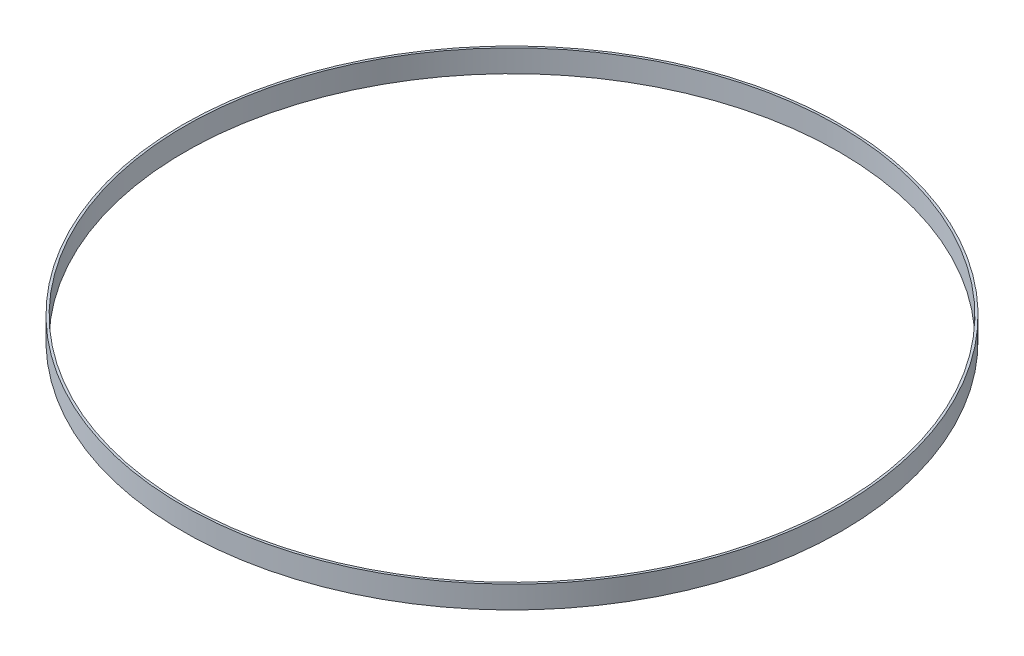
ISO-10303-21;
HEADER;
FILE_DESCRIPTION(('STEP AP214'),'2;1');
FILE_NAME('part.step','',(''),(''),'','','');
FILE_SCHEMA(('AUTOMOTIVE_DESIGN { 1 0 10303 214 1 1 1 1 }'));
ENDSEC;
DATA;
#1=APPLICATION_CONTEXT('core data for automotive mechanical design processes');
#2=APPLICATION_PROTOCOL_DEFINITION('international standard','automotive_design',2000,#1);
#3=PRODUCT_CONTEXT('',#1,'mechanical');
#4=PRODUCT('Part','Part','',(#3));
#5=PRODUCT_RELATED_PRODUCT_CATEGORY('part','',(#4));
#6=PRODUCT_DEFINITION_FORMATION('','',#4);
#7=PRODUCT_DEFINITION_CONTEXT('part definition',#1,'design');
#8=PRODUCT_DEFINITION('design','',#6,#7);
#9=PRODUCT_DEFINITION_SHAPE('','',#8);
#10=(LENGTH_UNIT() NAMED_UNIT(*) SI_UNIT(.MILLI.,.METRE.));
#11=(NAMED_UNIT(*) PLANE_ANGLE_UNIT() SI_UNIT($,.RADIAN.));
#12=(NAMED_UNIT(*) SI_UNIT($,.STERADIAN.) SOLID_ANGLE_UNIT());
#13=UNCERTAINTY_MEASURE_WITH_UNIT(LENGTH_MEASURE(1.E-05),#10,'distance_accuracy_value','');
#14=(GEOMETRIC_REPRESENTATION_CONTEXT(3) GLOBAL_UNCERTAINTY_ASSIGNED_CONTEXT((#13)) GLOBAL_UNIT_ASSIGNED_CONTEXT((#10,
#11,#12)) REPRESENTATION_CONTEXT('',''));
#15=CARTESIAN_POINT('',(0.,0.,0.));
#16=DIRECTION('',(0.,0.,1.));
#17=DIRECTION('',(1.,0.,0.));
#18=AXIS2_PLACEMENT_3D('',#15,#16,#17);
#19=CARTESIAN_POINT('',(0.,10.,0.));
#20=DIRECTION('',(0.,1.,0.));
#21=DIRECTION('',(0.,0.,1.));
#22=AXIS2_PLACEMENT_3D('',#19,#20,#21);
#23=PLANE('',#22);
#24=CARTESIAN_POINT('',(0.,10.,0.));
#25=DIRECTION('',(0.,1.,0.));
#26=DIRECTION('',(1.,0.,0.));
#27=AXIS2_PLACEMENT_3D('',#24,#25,#26);
#28=CIRCLE('',#27,147.05);
#29=CARTESIAN_POINT('',(147.05,10.,0.));
#30=VERTEX_POINT('',#29);
#31=EDGE_CURVE('E11',#30,#30,#28,.T.);
#32=ORIENTED_EDGE('',*,*,#31,.T.);
#33=EDGE_LOOP('',(#32));
#34=FACE_BOUND('',#33,.T.);
#35=CARTESIAN_POINT('',(0.,10.,0.));
#36=DIRECTION('',(0.,1.,0.));
#37=DIRECTION('',(0.,0.,1.));
#38=AXIS2_PLACEMENT_3D('',#35,#36,#37);
#39=CIRCLE('',#38,146.05);
#40=CARTESIAN_POINT('',(0.,10.,146.05));
#41=VERTEX_POINT('',#40);
#42=EDGE_CURVE('E56',#41,#41,#39,.T.);
#43=ORIENTED_EDGE('',*,*,#42,.F.);
#44=EDGE_LOOP('',(#43));
#45=FACE_BOUND('',#44,.T.);
#46=ADVANCED_FACE('F45',(#34,#45),#23,.T.);
#47=CARTESIAN_POINT('',(0.,0.,0.));
#48=DIRECTION('',(0.,1.,0.));
#49=DIRECTION('',(0.,0.,1.));
#50=AXIS2_PLACEMENT_3D('',#47,#48,#49);
#51=PLANE('',#50);
#52=CARTESIAN_POINT('',(0.,0.,0.));
#53=DIRECTION('',(0.,1.,0.));
#54=DIRECTION('',(1.,0.,0.));
#55=AXIS2_PLACEMENT_3D('',#52,#53,#54);
#56=CIRCLE('',#55,147.05);
#57=CARTESIAN_POINT('',(147.05,0.,0.));
#58=VERTEX_POINT('',#57);
#59=EDGE_CURVE('E49',#58,#58,#56,.T.);
#60=ORIENTED_EDGE('',*,*,#59,.F.);
#61=EDGE_LOOP('',(#60));
#62=FACE_BOUND('',#61,.T.);
#63=CARTESIAN_POINT('',(0.,0.,0.));
#64=DIRECTION('',(0.,1.,0.));
#65=DIRECTION('',(0.,0.,1.));
#66=AXIS2_PLACEMENT_3D('',#63,#64,#65);
#67=CIRCLE('',#66,146.05);
#68=CARTESIAN_POINT('',(0.,0.,146.05));
#69=VERTEX_POINT('',#68);
#70=EDGE_CURVE('E58',#69,#69,#67,.T.);
#71=ORIENTED_EDGE('',*,*,#70,.T.);
#72=EDGE_LOOP('',(#71));
#73=FACE_BOUND('',#72,.T.);
#74=ADVANCED_FACE('F68',(#62,#73),#51,.F.);
#75=CARTESIAN_POINT('',(0.,10.,0.));
#76=DIRECTION('',(0.,-1.,0.));
#77=DIRECTION('',(0.,0.,-1.));
#78=AXIS2_PLACEMENT_3D('',#75,#76,#77);
#79=CYLINDRICAL_SURFACE('',#78,147.05);
#80=ORIENTED_EDGE('',*,*,#31,.F.);
#81=EDGE_LOOP('',(#80));
#82=FACE_BOUND('',#81,.T.);
#83=ORIENTED_EDGE('',*,*,#59,.T.);
#84=EDGE_LOOP('',(#83));
#85=FACE_BOUND('',#84,.T.);
#86=ADVANCED_FACE('F47',(#82,#85),#79,.T.);
#87=CARTESIAN_POINT('',(0.,10.,0.));
#88=DIRECTION('',(0.,-1.,0.));
#89=DIRECTION('',(0.,0.,-1.));
#90=AXIS2_PLACEMENT_3D('',#87,#88,#89);
#91=CYLINDRICAL_SURFACE('',#90,146.05);
#92=ORIENTED_EDGE('',*,*,#42,.T.);
#93=EDGE_LOOP('',(#92));
#94=FACE_BOUND('',#93,.T.);
#95=ORIENTED_EDGE('',*,*,#70,.F.);
#96=EDGE_LOOP('',(#95));
#97=FACE_BOUND('',#96,.T.);
#98=ADVANCED_FACE('F64',(#94,#97),#91,.F.);
#99=CLOSED_SHELL('',(#46,#74,#86,#98));
#100=MANIFOLD_SOLID_BREP('B2',#99);
#101=ADVANCED_BREP_SHAPE_REPRESENTATION('',(#18,#100),#14);
#102=SHAPE_DEFINITION_REPRESENTATION(#9,#101);
ENDSEC;
END-ISO-10303-21;
